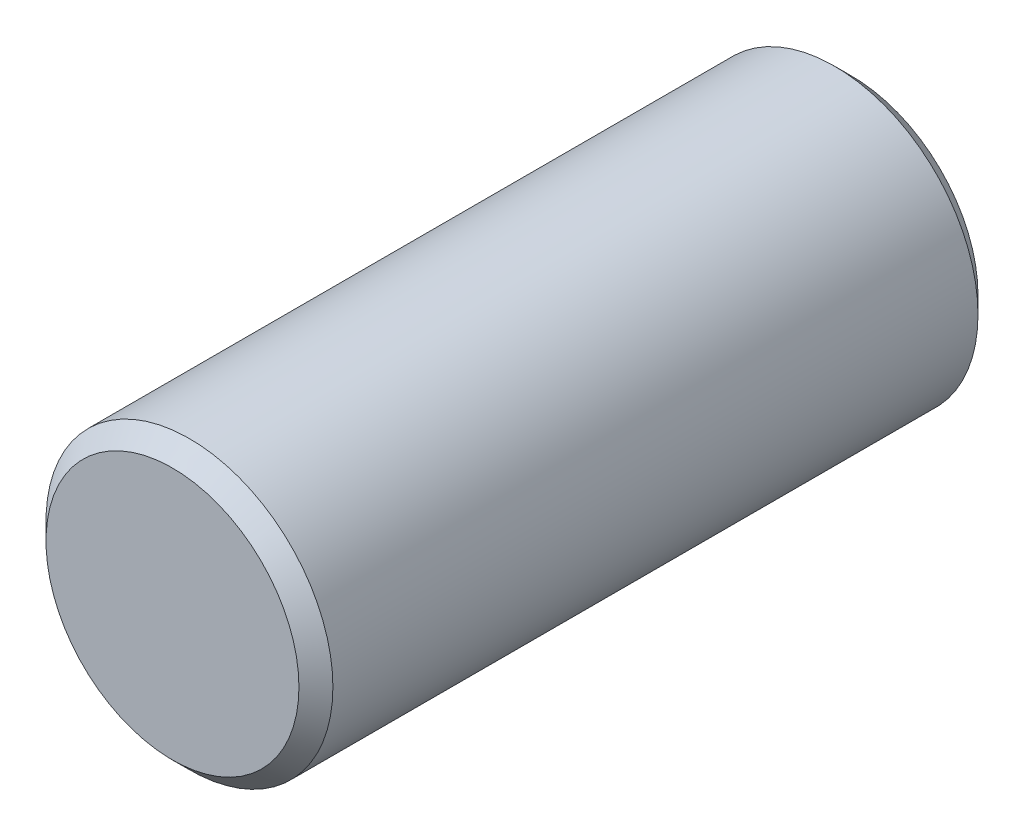
ISO-10303-21;
HEADER;
FILE_DESCRIPTION(('STEP AP214'),'2;1');
FILE_NAME('part.step','',(''),(''),'','','');
FILE_SCHEMA(('AUTOMOTIVE_DESIGN { 1 0 10303 214 1 1 1 1 }'));
ENDSEC;
DATA;
#1=APPLICATION_CONTEXT('core data for automotive mechanical design processes');
#2=APPLICATION_PROTOCOL_DEFINITION('international standard','automotive_design',2000,#1);
#3=PRODUCT_CONTEXT('',#1,'mechanical');
#4=PRODUCT('Part','Part','',(#3));
#5=PRODUCT_RELATED_PRODUCT_CATEGORY('part','',(#4));
#6=PRODUCT_DEFINITION_FORMATION('','',#4);
#7=PRODUCT_DEFINITION_CONTEXT('part definition',#1,'design');
#8=PRODUCT_DEFINITION('design','',#6,#7);
#9=PRODUCT_DEFINITION_SHAPE('','',#8);
#10=(LENGTH_UNIT() NAMED_UNIT(*) SI_UNIT(.MILLI.,.METRE.));
#11=(NAMED_UNIT(*) PLANE_ANGLE_UNIT() SI_UNIT($,.RADIAN.));
#12=(NAMED_UNIT(*) SI_UNIT($,.STERADIAN.) SOLID_ANGLE_UNIT());
#13=UNCERTAINTY_MEASURE_WITH_UNIT(LENGTH_MEASURE(1.E-05),#10,'distance_accuracy_value','');
#14=(GEOMETRIC_REPRESENTATION_CONTEXT(3) GLOBAL_UNCERTAINTY_ASSIGNED_CONTEXT((#13)) GLOBAL_UNIT_ASSIGNED_CONTEXT((#10,
#11,#12)) REPRESENTATION_CONTEXT('',''));
#15=CARTESIAN_POINT('',(0.,0.,0.));
#16=DIRECTION('',(0.,0.,1.));
#17=DIRECTION('',(1.,0.,0.));
#18=AXIS2_PLACEMENT_3D('',#15,#16,#17);
#19=CARTESIAN_POINT('',(0.,0.,80.));
#20=DIRECTION('',(0.,0.,-1.));
#21=DIRECTION('',(-1.,0.,0.));
#22=AXIS2_PLACEMENT_3D('',#19,#20,#21);
#23=CYLINDRICAL_SURFACE('',#22,16.9);
#24=CARTESIAN_POINT('',(0.,0.,1.99999999999999));
#25=DIRECTION('',(0.,0.,1.));
#26=DIRECTION('',(1.,0.,0.));
#27=AXIS2_PLACEMENT_3D('',#24,#25,#26);
#28=CIRCLE('',#27,16.9);
#29=CARTESIAN_POINT('',(16.9,0.,1.99999999999999));
#30=VERTEX_POINT('',#29);
#31=EDGE_CURVE('E46',#30,#30,#28,.T.);
#32=ORIENTED_EDGE('',*,*,#31,.T.);
#33=EDGE_LOOP('',(#32));
#34=FACE_BOUND('',#33,.T.);
#35=CARTESIAN_POINT('',(0.,0.,78.));
#36=DIRECTION('',(0.,0.,1.));
#37=DIRECTION('',(1.,0.,0.));
#38=AXIS2_PLACEMENT_3D('',#35,#36,#37);
#39=CIRCLE('',#38,16.9);
#40=CARTESIAN_POINT('',(16.9,0.,78.));
#41=VERTEX_POINT('',#40);
#42=EDGE_CURVE('E50',#41,#41,#39,.F.);
#43=ORIENTED_EDGE('',*,*,#42,.T.);
#44=EDGE_LOOP('',(#43));
#45=FACE_BOUND('',#44,.T.);
#46=ADVANCED_FACE('F34',(#34,#45),#23,.T.);
#47=CARTESIAN_POINT('',(0.,0.,80.));
#48=DIRECTION('',(0.,0.,1.));
#49=DIRECTION('',(1.,0.,0.));
#50=AXIS2_PLACEMENT_3D('',#47,#48,#49);
#51=PLANE('',#50);
#52=CARTESIAN_POINT('',(0.,0.,80.));
#53=DIRECTION('',(0.,0.,1.));
#54=DIRECTION('',(1.,0.,0.));
#55=AXIS2_PLACEMENT_3D('',#52,#53,#54);
#56=CIRCLE('',#55,14.9);
#57=CARTESIAN_POINT('',(14.9,0.,80.));
#58=VERTEX_POINT('',#57);
#59=EDGE_CURVE('E10',#58,#58,#56,.T.);
#60=ORIENTED_EDGE('',*,*,#59,.T.);
#61=EDGE_LOOP('',(#60));
#62=FACE_BOUND('',#61,.T.);
#63=ADVANCED_FACE('F66',(#62),#51,.T.);
#64=CARTESIAN_POINT('',(0.,0.,0.));
#65=DIRECTION('',(0.,0.,1.));
#66=DIRECTION('',(1.,0.,0.));
#67=AXIS2_PLACEMENT_3D('',#64,#65,#66);
#68=PLANE('',#67);
#69=CARTESIAN_POINT('',(0.,0.,0.));
#70=DIRECTION('',(0.,0.,1.));
#71=DIRECTION('',(1.,0.,0.));
#72=AXIS2_PLACEMENT_3D('',#69,#70,#71);
#73=CIRCLE('',#72,14.9);
#74=CARTESIAN_POINT('',(14.9,0.,0.));
#75=VERTEX_POINT('',#74);
#76=EDGE_CURVE('E42',#75,#75,#73,.F.);
#77=ORIENTED_EDGE('',*,*,#76,.T.);
#78=EDGE_LOOP('',(#77));
#79=FACE_BOUND('',#78,.T.);
#80=ADVANCED_FACE('F63',(#79),#68,.F.);
#81=CARTESIAN_POINT('',(0.,0.,1.99999999999999));
#82=DIRECTION('',(0.,0.,1.));
#83=DIRECTION('',(1.,0.,0.));
#84=AXIS2_PLACEMENT_3D('',#81,#82,#83);
#85=CONICAL_SURFACE('',#84,16.9,0.785398163397448);
#86=ORIENTED_EDGE('',*,*,#76,.F.);
#87=EDGE_LOOP('',(#86));
#88=FACE_BOUND('',#87,.T.);
#89=ORIENTED_EDGE('',*,*,#31,.F.);
#90=EDGE_LOOP('',(#89));
#91=FACE_BOUND('',#90,.T.);
#92=ADVANCED_FACE('F59',(#88,#91),#85,.T.);
#93=CARTESIAN_POINT('',(0.,0.,80.));
#94=DIRECTION('',(0.,0.,-1.));
#95=DIRECTION('',(-1.,0.,0.));
#96=AXIS2_PLACEMENT_3D('',#93,#94,#95);
#97=CONICAL_SURFACE('',#96,14.9,0.785398163397448);
#98=ORIENTED_EDGE('',*,*,#42,.F.);
#99=EDGE_LOOP('',(#98));
#100=FACE_BOUND('',#99,.T.);
#101=ORIENTED_EDGE('',*,*,#59,.F.);
#102=EDGE_LOOP('',(#101));
#103=FACE_BOUND('',#102,.T.);
#104=ADVANCED_FACE('F37',(#100,#103),#97,.T.);
#105=CLOSED_SHELL('',(#46,#63,#80,#92,#104));
#106=MANIFOLD_SOLID_BREP('B2',#105);
#107=ADVANCED_BREP_SHAPE_REPRESENTATION('',(#18,#106),#14);
#108=SHAPE_DEFINITION_REPRESENTATION(#9,#107);
ENDSEC;
END-ISO-10303-21;
